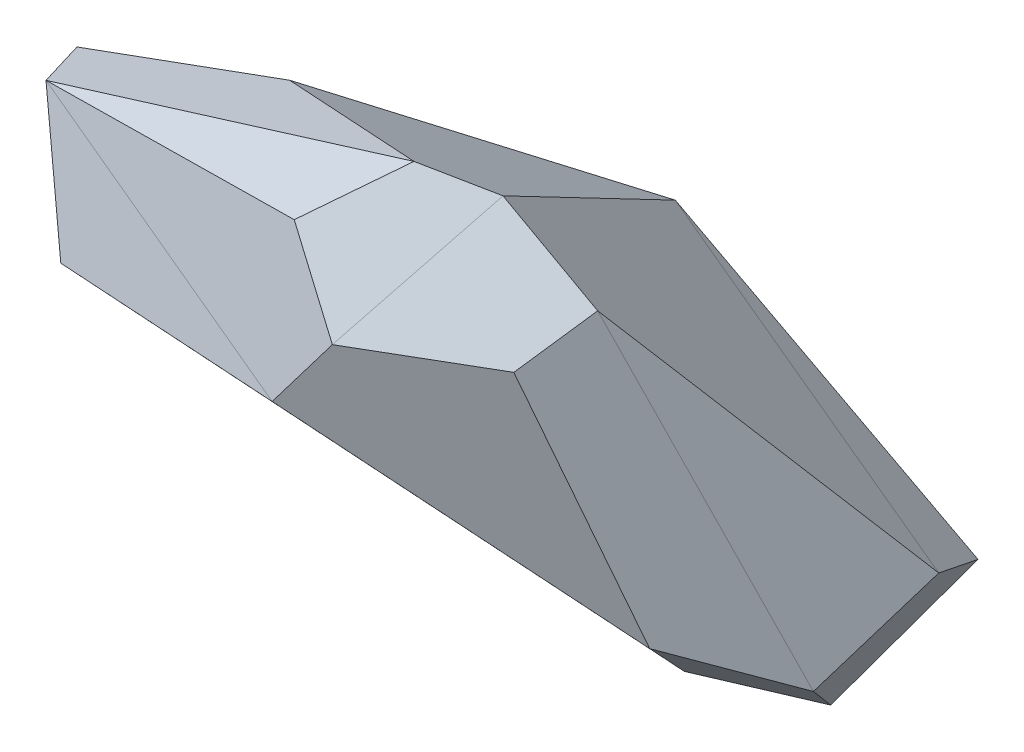
ISO-10303-21;
HEADER;
FILE_DESCRIPTION(('STEP AP214'),'2;1');
FILE_NAME('part.step','',(''),(''),'','','');
FILE_SCHEMA(('AUTOMOTIVE_DESIGN { 1 0 10303 214 1 1 1 1 }'));
ENDSEC;
DATA;
#1=APPLICATION_CONTEXT('core data for automotive mechanical design processes');
#2=APPLICATION_PROTOCOL_DEFINITION('international standard','automotive_design',2000,#1);
#3=PRODUCT_CONTEXT('',#1,'mechanical');
#4=PRODUCT('Part','Part','',(#3));
#5=PRODUCT_RELATED_PRODUCT_CATEGORY('part','',(#4));
#6=PRODUCT_DEFINITION_FORMATION('','',#4);
#7=PRODUCT_DEFINITION_CONTEXT('part definition',#1,'design');
#8=PRODUCT_DEFINITION('design','',#6,#7);
#9=PRODUCT_DEFINITION_SHAPE('','',#8);
#10=(LENGTH_UNIT() NAMED_UNIT(*) SI_UNIT(.MILLI.,.METRE.));
#11=(NAMED_UNIT(*) PLANE_ANGLE_UNIT() SI_UNIT($,.RADIAN.));
#12=(NAMED_UNIT(*) SI_UNIT($,.STERADIAN.) SOLID_ANGLE_UNIT());
#13=UNCERTAINTY_MEASURE_WITH_UNIT(LENGTH_MEASURE(1.E-05),#10,'distance_accuracy_value','');
#14=(GEOMETRIC_REPRESENTATION_CONTEXT(3) GLOBAL_UNCERTAINTY_ASSIGNED_CONTEXT((#13)) GLOBAL_UNIT_ASSIGNED_CONTEXT((#10,
#11,#12)) REPRESENTATION_CONTEXT('',''));
#15=CARTESIAN_POINT('',(0.,0.,0.));
#16=DIRECTION('',(0.,0.,1.));
#17=DIRECTION('',(1.,0.,0.));
#18=AXIS2_PLACEMENT_3D('',#15,#16,#17);
#19=CARTESIAN_POINT('',(-2.09892344621578,18.4063837587297,34.6763323115808));
#20=DIRECTION('',(-0.297455677009963,0.155004880453172,-0.942068791145446));
#21=DIRECTION('',(0.94644728230118,0.177610310381171,-0.269614761226114));
#22=AXIS2_PLACEMENT_3D('',#19,#20,#21);
#23=PLANE('',#22);
#24=DIRECTION('',(0.94644728230118,0.177610310381171,-0.269614761226113));
#25=VECTOR('',#24,1.);
#26=CARTESIAN_POINT('',(6.29828554401072,19.9822041165878,32.2842165126311));
#27=LINE('',#26,#25);
#28=CARTESIAN_POINT('',(-2.09892344621578,18.4063837587297,34.6763323115808));
#29=VERTEX_POINT('',#28);
#30=CARTESIAN_POINT('',(14.6954945342372,21.558024474446,29.8921007136813));
#31=VERTEX_POINT('',#30);
#32=EDGE_CURVE('E3185',#29,#31,#27,.T.);
#33=ORIENTED_EDGE('',*,*,#32,.F.);
#34=DIRECTION('',(-0.594855869065675,-0.801887428335408,0.0558842313693848));
#35=VECTOR('',#34,1.);
#36=CARTESIAN_POINT('',(-5.37063072607699,13.996002902885,34.9836955841124));
#37=LINE('',#36,#35);
#38=CARTESIAN_POINT('',(-8.6423380059382,9.58562204704023,35.291058856644));
#39=VERTEX_POINT('',#38);
#40=EDGE_CURVE('E3161',#29,#39,#37,.T.);
#41=ORIENTED_EDGE('',*,*,#40,.T.);
#42=DIRECTION('',(0.846057099966531,-0.414418816290542,-0.335327344993769));
#43=VECTOR('',#42,1.);
#44=CARTESIAN_POINT('',(7.43274689342594,1.71166453751991,28.9198393017624));
#45=LINE('',#44,#43);
#46=CARTESIAN_POINT('',(23.5078317927901,-6.16229297200041,22.5486197468808));
#47=VERTEX_POINT('',#46);
#48=EDGE_CURVE('E3177',#39,#47,#45,.T.);
#49=ORIENTED_EDGE('',*,*,#48,.T.);
#50=DIRECTION('',(0.293744575285096,-0.924010581548212,-0.244782698893352));
#51=VECTOR('',#50,1.);
#52=CARTESIAN_POINT('',(19.1016631635137,7.69786575122277,26.220360230281));
#53=LINE('',#52,#51);
#54=EDGE_CURVE('E3075',#31,#47,#53,.T.);
#55=ORIENTED_EDGE('',*,*,#54,.F.);
#56=EDGE_LOOP('',(#33,#41,#49,#55));
#57=FACE_BOUND('',#56,.T.);
#58=ADVANCED_FACE('F3072',(#57),#23,.F.);
#59=CARTESIAN_POINT('',(14.6954945342372,21.558024474446,29.8921007136813));
#60=DIRECTION('',(0.614697790089484,-0.0135095899664102,0.788647017263138));
#61=DIRECTION('',(0.293744575285096,-0.924010581548212,-0.244782698893352));
#62=AXIS2_PLACEMENT_3D('',#59,#60,#61);
#63=PLANE('',#62);
#64=ORIENTED_EDGE('',*,*,#54,.T.);
#65=DIRECTION('',(0.766230871240792,-0.227047819556639,-0.60111524651447));
#66=VECTOR('',#65,1.);
#67=CARTESIAN_POINT('',(28.9628924384361,-7.77872435271143,18.2690739235066));
#68=LINE('',#67,#66);
#69=CARTESIAN_POINT('',(34.4179530840821,-9.39515573342245,13.9895281001324));
#70=VERTEX_POINT('',#69);
#71=EDGE_CURVE('E3176',#47,#70,#68,.T.);
#72=ORIENTED_EDGE('',*,*,#71,.T.);
#73=DIRECTION('',(-0.333553617036009,0.901599573935553,0.275427291388173));
#74=VECTOR('',#73,1.);
#75=CARTESIAN_POINT('',(27.3933069480253,9.59255011008235,19.7900326049468));
#76=LINE('',#75,#74);
#77=CARTESIAN_POINT('',(20.3686608119686,28.5802559535871,25.5905371097612));
#78=VERTEX_POINT('',#77);
#79=EDGE_CURVE('E3201',#70,#78,#76,.T.);
#80=ORIENTED_EDGE('',*,*,#79,.T.);
#81=DIRECTION('',(0.567316627773139,0.702223147914119,-0.430156360392008));
#82=VECTOR('',#81,1.);
#83=CARTESIAN_POINT('',(17.5320776731029,25.0691402140165,27.7413189117213));
#84=LINE('',#83,#82);
#85=EDGE_CURVE('E3196',#31,#78,#84,.T.);
#86=ORIENTED_EDGE('',*,*,#85,.F.);
#87=EDGE_LOOP('',(#64,#72,#80,#86));
#88=FACE_BOUND('',#87,.T.);
#89=ADVANCED_FACE('F3390',(#88),#63,.T.);
#90=CARTESIAN_POINT('',(-42.3077182006926,22.4414726260732,28.5185493470746));
#91=DIRECTION('',(0.132898567566858,-0.166675754850237,-0.977014413140247));
#92=DIRECTION('',(0.918128581686899,-0.350607175389791,0.184701153366177));
#93=AXIS2_PLACEMENT_3D('',#90,#91,#92);
#94=PLANE('',#93);
#95=DIRECTION('',(-0.918128581686899,0.350607175389791,-0.184701153366177));
#96=VECTOR('',#95,1.);
#97=CARTESIAN_POINT('',(-25.4750281033154,16.0135473365567,31.9048041018593));
#98=LINE('',#97,#96);
#99=CARTESIAN_POINT('',(-42.3077182006926,22.4414726260732,28.5185493470746));
#100=VERTEX_POINT('',#99);
#101=EDGE_CURVE('E3156',#39,#100,#98,.T.);
#102=ORIENTED_EDGE('',*,*,#101,.T.);
#103=DIRECTION('',(0.311518313119949,-0.928777300135052,0.200820983327802));
#104=VECTOR('',#103,1.);
#105=CARTESIAN_POINT('',(-39.8325310795823,15.0618178357988,30.1141843086387));
#106=LINE('',#105,#104);
#107=CARTESIAN_POINT('',(-37.3573439584721,7.68216304552448,31.7098192702028));
#108=VERTEX_POINT('',#107);
#109=EDGE_CURVE('E3171',#100,#108,#106,.T.);
#110=ORIENTED_EDGE('',*,*,#109,.T.);
#111=DIRECTION('',(-0.990172619052892,-0.0656365172936465,-0.123491020222109));
#112=VECTOR('',#111,1.);
#113=CARTESIAN_POINT('',(-22.9998409822051,8.63389254628235,33.5004390634234));
#114=LINE('',#113,#112);
#115=EDGE_CURVE('E3168',#39,#108,#114,.T.);
#116=ORIENTED_EDGE('',*,*,#115,.F.);
#117=EDGE_LOOP('',(#102,#110,#116));
#118=FACE_BOUND('',#117,.T.);
#119=ADVANCED_FACE('F3170',(#118),#94,.F.);
#120=CARTESIAN_POINT('',(-2.09892344621578,18.4063837587297,34.6763323115808));
#121=DIRECTION('',(-0.132898567566857,0.166675754850237,0.977014413140247));
#122=DIRECTION('',(-0.625353966159292,0.750672727387448,-0.213126425779474));
#123=AXIS2_PLACEMENT_3D('',#120,#121,#122);
#124=PLANE('',#123);
#125=DIRECTION('',(0.625353966159292,-0.750672727387448,0.213126425779473));
#126=VECTOR('',#125,1.);
#127=CARTESIAN_POINT('',(-5.53837026009189,22.5350837593607,33.5041369697937));
#128=LINE('',#127,#126);
#129=CARTESIAN_POINT('',(-8.97781707396799,26.6637837599916,32.3319416280066));
#130=VERTEX_POINT('',#129);
#131=EDGE_CURVE('E3219',#130,#29,#128,.T.);
#132=ORIENTED_EDGE('',*,*,#131,.F.);
#133=DIRECTION('',(-0.985741420922727,-0.124876067315704,-0.112782174517991));
#134=VECTOR('',#133,1.);
#135=CARTESIAN_POINT('',(-25.6427676373303,24.5526281930324,30.4252454875406));
#136=LINE('',#135,#134);
#137=EDGE_CURVE('E3162',#130,#100,#136,.T.);
#138=ORIENTED_EDGE('',*,*,#137,.T.);
#139=ORIENTED_EDGE('',*,*,#101,.F.);
#140=ORIENTED_EDGE('',*,*,#40,.F.);
#141=EDGE_LOOP('',(#132,#138,#139,#140));
#142=FACE_BOUND('',#141,.T.);
#143=ADVANCED_FACE('F3159',(#142),#124,.T.);
#144=CARTESIAN_POINT('',(-8.6423380059382,9.58562204704023,35.291058856644));
#145=DIRECTION('',(-0.0456387462814506,-0.683021414363463,0.728971091579626));
#146=DIRECTION('',(-0.990172619052892,-0.0656365172936463,-0.123491020222109));
#147=AXIS2_PLACEMENT_3D('',#144,#145,#146);
#148=PLANE('',#147);
#149=ORIENTED_EDGE('',*,*,#115,.T.);
#150=DIRECTION('',(-0.22446108834939,-0.704060010426134,-0.673733420230702));
#151=VECTOR('',#150,1.);
#152=CARTESIAN_POINT('',(-38.8163410327431,3.10577297775462,27.3305520387033));
#153=LINE('',#152,#151);
#154=CARTESIAN_POINT('',(-40.2753381070141,-1.47061709001525,22.9512848072037));
#155=VERTEX_POINT('',#154);
#156=EDGE_CURVE('E3205',#108,#155,#153,.T.);
#157=ORIENTED_EDGE('',*,*,#156,.T.);
#158=DIRECTION('',(0.997285872786953,-0.073357001292804,-0.0062958955592176));
#159=VECTOR('',#158,1.);
#160=CARTESIAN_POINT('',(-8.38375315711202,-3.81645503100783,22.7499522770422));
#161=LINE('',#160,#159);
#162=EDGE_CURVE('E3181',#155,#47,#161,.T.);
#163=ORIENTED_EDGE('',*,*,#162,.T.);
#164=ORIENTED_EDGE('',*,*,#48,.F.);
#165=EDGE_LOOP('',(#149,#157,#163,#164));
#166=FACE_BOUND('',#165,.T.);
#167=ADVANCED_FACE('F3180',(#166),#148,.T.);
#168=CARTESIAN_POINT('',(15.1328414363407,-18.9438187059818,10.0484260495026));
#169=DIRECTION('',(-0.250607009139643,0.755818503580984,-0.604925215720658));
#170=DIRECTION('',(0.424213196710011,0.64741470254567,0.633164565231485));
#171=AXIS2_PLACEMENT_3D('',#168,#169,#170);
#172=PLANE('',#171);
#173=DIRECTION('',(0.424213196710011,0.647414702545669,0.633164565231485));
#174=VECTOR('',#173,1.);
#175=CARTESIAN_POINT('',(19.3203366145654,-12.5530558389911,16.2985228981917));
#176=LINE('',#175,#174);
#177=CARTESIAN_POINT('',(15.1328414363407,-18.9438187059818,10.0484260495026));
#178=VERTEX_POINT('',#177);
#179=EDGE_CURVE('E3224',#178,#47,#176,.T.);
#180=ORIENTED_EDGE('',*,*,#179,.F.);
#181=DIRECTION('',(0.953520748583935,0.0847171222608654,-0.289173289250183));
#182=VECTOR('',#181,1.);
#183=CARTESIAN_POINT('',(21.8074866764283,-18.3507988501557,8.02421302475128));
#184=LINE('',#183,#182);
#185=CARTESIAN_POINT('',(28.4821319165158,-17.7577789943297,6.));
#186=VERTEX_POINT('',#185);
#187=EDGE_CURVE('E3227',#178,#186,#184,.T.);
#188=ORIENTED_EDGE('',*,*,#187,.T.);
#189=DIRECTION('',(0.456601628274327,0.64327871237748,0.614579084625571));
#190=VECTOR('',#189,1.);
#191=CARTESIAN_POINT('',(31.450042500299,-13.5764673638761,9.99476405006621));
#192=LINE('',#191,#190);
#193=EDGE_CURVE('E3239',#186,#70,#192,.T.);
#194=ORIENTED_EDGE('',*,*,#193,.T.);
#195=ORIENTED_EDGE('',*,*,#71,.F.);
#196=EDGE_LOOP('',(#180,#188,#194,#195));
#197=FACE_BOUND('',#196,.T.);
#198=ADVANCED_FACE('F3401',(#197),#172,.F.);
#199=CARTESIAN_POINT('',(-2.09892344621578,18.4063837587297,34.6763323115808));
#200=DIRECTION('',(0.179618886480074,0.404256945620397,0.89683520087992));
#201=DIRECTION('',(0.94644728230118,0.177610310381171,-0.269614761226114));
#202=AXIS2_PLACEMENT_3D('',#199,#200,#201);
#203=PLANE('',#202);
#204=ORIENTED_EDGE('',*,*,#32,.T.);
#205=ORIENTED_EDGE('',*,*,#85,.T.);
#206=DIRECTION('',(-0.891448093755237,0.452411003303571,-0.0253885846397657));
#207=VECTOR('',#206,1.);
#208=CARTESIAN_POINT('',(14.5742482025596,31.5209274750604,25.4255113096028));
#209=LINE('',#208,#207);
#210=CARTESIAN_POINT('',(8.77983559315053,34.4615989965336,25.2604855094443));
#211=VERTEX_POINT('',#210);
#212=EDGE_CURVE('E3243',#78,#211,#209,.T.);
#213=ORIENTED_EDGE('',*,*,#212,.T.);
#214=DIRECTION('',(0.504612194397336,0.744722570226326,-0.436754881668197));
#215=VECTOR('',#214,1.);
#216=CARTESIAN_POINT('',(3.34045607346737,26.4339913776316,29.9684089105125));
#217=LINE('',#216,#215);
#218=EDGE_CURVE('E3216',#29,#211,#217,.T.);
#219=ORIENTED_EDGE('',*,*,#218,.F.);
#220=EDGE_LOOP('',(#204,#205,#213,#219));
#221=FACE_BOUND('',#220,.T.);
#222=ADVANCED_FACE('F3387',(#221),#203,.T.);
#223=CARTESIAN_POINT('',(34.4179530840821,-9.39515573342245,13.9895281001324));
#224=DIRECTION('',(-0.614697790089484,0.0135095899664101,-0.788647017263138));
#225=DIRECTION('',(-0.333553617036009,0.901599573935553,0.275427291388173));
#226=AXIS2_PLACEMENT_3D('',#223,#224,#225);
#227=PLANE('',#226);
#228=ORIENTED_EDGE('',*,*,#79,.F.);
#229=DIRECTION('',(0.500325148469735,0.779638384146126,-0.376614837433094));
#230=VECTOR('',#229,1.);
#231=CARTESIAN_POINT('',(38.6707168460748,-2.76822946818038,10.7883019819511));
#232=LINE('',#231,#230);
#233=CARTESIAN_POINT('',(42.9234806080676,3.85869679706168,7.58707586376983));
#234=VERTEX_POINT('',#233);
#235=EDGE_CURVE('E3235',#70,#234,#232,.T.);
#236=ORIENTED_EDGE('',*,*,#235,.T.);
#237=DIRECTION('',(0.593547889371026,-0.650567346224354,-0.473775295947142));
#238=VECTOR('',#237,1.);
#239=CARTESIAN_POINT('',(31.6460707100181,16.2194763753244,16.5888064867655));
#240=LINE('',#239,#238);
#241=EDGE_CURVE('E3247',#78,#234,#240,.T.);
#242=ORIENTED_EDGE('',*,*,#241,.F.);
#243=EDGE_LOOP('',(#228,#236,#242));
#244=FACE_BOUND('',#243,.T.);
#245=ADVANCED_FACE('F3393',(#244),#227,.F.);
#246=CARTESIAN_POINT('',(-42.3077182006926,22.4414726260732,28.5185493470746));
#247=DIRECTION('',(-0.858397334777297,-0.184408911421273,0.4786933977356));
#248=DIRECTION('',(-0.432085413612605,-0.243069479192463,-0.868458072464255));
#249=AXIS2_PLACEMENT_3D('',#246,#247,#248);
#250=PLANE('',#249);
#251=DIRECTION('',(-0.432085413612602,-0.243069479192461,-0.868458072464257));
#252=VECTOR('',#251,1.);
#253=CARTESIAN_POINT('',(-44.1320059162753,21.4152202904147,24.8518729373134));
#254=LINE('',#253,#252);
#255=CARTESIAN_POINT('',(-45.9562936318581,20.3889679547562,21.1851965275523));
#256=VERTEX_POINT('',#255);
#257=EDGE_CURVE('E3253',#100,#256,#254,.T.);
#258=ORIENTED_EDGE('',*,*,#257,.T.);
#259=DIRECTION('',(-0.250763181954698,0.964904421107351,-0.0779569413422691));
#260=VECTOR('',#259,1.);
#261=CARTESIAN_POINT('',(-43.1158158694361,9.45917543237046,22.068240667378));
#262=LINE('',#261,#260);
#263=EDGE_CURVE('E3250',#155,#256,#262,.T.);
#264=ORIENTED_EDGE('',*,*,#263,.F.);
#265=ORIENTED_EDGE('',*,*,#156,.F.);
#266=ORIENTED_EDGE('',*,*,#109,.F.);
#267=EDGE_LOOP('',(#258,#264,#265,#266));
#268=FACE_BOUND('',#267,.T.);
#269=ADVANCED_FACE('F3375',(#268),#250,.T.);
#270=CARTESIAN_POINT('',(-8.97781707396799,26.6637837599916,32.3319416280066));
#271=DIRECTION('',(0.167774932974968,-0.678175936582941,-0.715492117989497));
#272=DIRECTION('',(-0.985741420922727,-0.124876067315704,-0.112782174517991));
#273=AXIS2_PLACEMENT_3D('',#270,#271,#272);
#274=PLANE('',#273);
#275=ORIENTED_EDGE('',*,*,#137,.F.);
#276=DIRECTION('',(0.6870528400917,0.600921682619212,-0.408474633582093));
#277=VECTOR('',#276,1.);
#278=CARTESIAN_POINT('',(-4.51197361337194,30.5697746970165,29.676856509723));
#279=LINE('',#278,#277);
#280=CARTESIAN_POINT('',(-0.0461301527758844,34.4757656340414,27.0217713914394));
#281=VERTEX_POINT('',#280);
#282=EDGE_CURVE('E3212',#130,#281,#279,.T.);
#283=ORIENTED_EDGE('',*,*,#282,.T.);
#284=DIRECTION('',(-0.96120923699618,-0.27371128569192,0.034043131437882));
#285=VECTOR('',#284,1.);
#286=CARTESIAN_POINT('',(-21.1769241767342,28.4586191300573,27.770160369257));
#287=LINE('',#286,#285);
#288=EDGE_CURVE('E3257',#281,#100,#287,.T.);
#289=ORIENTED_EDGE('',*,*,#288,.T.);
#290=EDGE_LOOP('',(#275,#283,#289));
#291=FACE_BOUND('',#290,.T.);
#292=ADVANCED_FACE('F3382',(#291),#274,.F.);
#293=CARTESIAN_POINT('',(-8.97781707396799,26.6637837599916,32.3319416280066));
#294=DIRECTION('',(0.179618886480067,0.404256945620393,0.896835200879923));
#295=DIRECTION('',(0.625353966159292,-0.750672727387448,0.213126425779474));
#296=AXIS2_PLACEMENT_3D('',#293,#294,#295);
#297=PLANE('',#296);
#298=ORIENTED_EDGE('',*,*,#131,.T.);
#299=ORIENTED_EDGE('',*,*,#218,.T.);
#300=DIRECTION('',(0.98066286065849,-0.00157407083420612,-0.195698431332791));
#301=VECTOR('',#300,1.);
#302=CARTESIAN_POINT('',(4.36685272018732,34.4686823152875,26.1411284504418));
#303=LINE('',#302,#301);
#304=EDGE_CURVE('E3267',#281,#211,#303,.T.);
#305=ORIENTED_EDGE('',*,*,#304,.F.);
#306=ORIENTED_EDGE('',*,*,#282,.F.);
#307=EDGE_LOOP('',(#298,#299,#305,#306));
#308=FACE_BOUND('',#307,.T.);
#309=ADVANCED_FACE('F3384',(#308),#297,.T.);
#310=CARTESIAN_POINT('',(-18.822702939603,-18.4551568705942,8.38042852433937));
#311=DIRECTION('',(-0.0456387462814504,-0.683021414363462,0.728971091579627));
#312=DIRECTION('',(0.998692481645404,-0.0143724069231654,0.0490587507400938));
#313=AXIS2_PLACEMENT_3D('',#310,#311,#312);
#314=PLANE('',#313);
#315=DIRECTION('',(0.998692481645404,-0.0143724069231654,0.0490587507400936));
#316=VECTOR('',#315,1.);
#317=CARTESIAN_POINT('',(-1.84493075163114,-18.699487788288,9.21442728692097));
#318=LINE('',#317,#316);
#319=CARTESIAN_POINT('',(-18.822702939603,-18.4551568705942,8.38042852433937));
#320=VERTEX_POINT('',#319);
#321=EDGE_CURVE('E3231',#320,#178,#318,.T.);
#322=ORIENTED_EDGE('',*,*,#321,.T.);
#323=ORIENTED_EDGE('',*,*,#179,.T.);
#324=ORIENTED_EDGE('',*,*,#162,.F.);
#325=DIRECTION('',(0.692020489271326,-0.547888380018675,-0.470027622027883));
#326=VECTOR('',#325,1.);
#327=CARTESIAN_POINT('',(-29.5490205233086,-9.96288698030471,15.6658566657715));
#328=LINE('',#327,#326);
#329=EDGE_CURVE('E3271',#155,#320,#328,.T.);
#330=ORIENTED_EDGE('',*,*,#329,.T.);
#331=EDGE_LOOP('',(#322,#323,#324,#330));
#332=FACE_BOUND('',#331,.T.);
#333=ADVANCED_FACE('F3373',(#332),#314,.T.);
#334=CARTESIAN_POINT('',(-18.822702939603,-18.4551568705942,8.38042852433937));
#335=DIRECTION('',(0.,-0.959664872997422,-0.281146459225155));
#336=DIRECTION('',(0.747357556512321,0.186799911485041,-0.637622518260697));
#337=AXIS2_PLACEMENT_3D('',#334,#335,#336);
#338=PLANE('',#337);
#339=DIRECTION('',(-0.747357556512321,-0.186799911485041,0.637622518260697));
#340=VECTOR('',#339,1.);
#341=CARTESIAN_POINT('',(-13.9113514698015,-17.2275784352971,4.19021426216968));
#342=LINE('',#341,#340);
#343=CARTESIAN_POINT('',(-8.99999999999999,-16.,0.));
#344=VERTEX_POINT('',#343);
#345=EDGE_CURVE('E3277',#344,#320,#342,.T.);
#346=ORIENTED_EDGE('',*,*,#345,.F.);
#347=DIRECTION('',(0.98637189253989,-0.0462573419560442,0.157894736842105));
#348=VECTOR('',#347,1.);
#349=CARTESIAN_POINT('',(9.74106595825792,-16.8788894971648,3.));
#350=LINE('',#349,#348);
#351=EDGE_CURVE('E3289',#344,#186,#350,.T.);
#352=ORIENTED_EDGE('',*,*,#351,.T.);
#353=ORIENTED_EDGE('',*,*,#187,.F.);
#354=ORIENTED_EDGE('',*,*,#321,.F.);
#355=EDGE_LOOP('',(#346,#352,#353,#354));
#356=FACE_BOUND('',#355,.T.);
#357=ADVANCED_FACE('F3369',(#356),#338,.T.);
#358=CARTESIAN_POINT('',(28.4821319165158,-17.7577789943297,6.));
#359=DIRECTION('',(0.83219891632312,-0.553077186895706,-0.0393775190452227));
#360=DIRECTION('',(0.52353945834019,0.807171772469531,-0.272727272727273));
#361=AXIS2_PLACEMENT_3D('',#358,#359,#360);
#362=PLANE('',#361);
#363=DIRECTION('',(-0.52353945834019,-0.807171772469531,0.272727272727273));
#364=VECTOR('',#363,1.);
#365=CARTESIAN_POINT('',(34.2410659582579,-8.87888949716484,3.));
#366=LINE('',#365,#364);
#367=CARTESIAN_POINT('',(40.,0.,0.));
#368=VERTEX_POINT('',#367);
#369=EDGE_CURVE('E3285',#368,#186,#366,.T.);
#370=ORIENTED_EDGE('',*,*,#369,.F.);
#371=DIRECTION('',(-0.324831178674177,-0.428744088562408,-0.843008429307759));
#372=VECTOR('',#371,1.);
#373=CARTESIAN_POINT('',(41.4617403040338,1.92934839853084,3.79353793188492));
#374=LINE('',#373,#372);
#375=EDGE_CURVE('E3293',#234,#368,#374,.T.);
#376=ORIENTED_EDGE('',*,*,#375,.F.);
#377=ORIENTED_EDGE('',*,*,#235,.F.);
#378=ORIENTED_EDGE('',*,*,#193,.F.);
#379=EDGE_LOOP('',(#370,#376,#377,#378));
#380=FACE_BOUND('',#379,.T.);
#381=ADVANCED_FACE('F3362',(#380),#362,.T.);
#382=CARTESIAN_POINT('',(20.3686608119686,28.5802559535871,25.5905371097612));
#383=DIRECTION('',(0.394984485957697,0.748391657604056,-0.53282002841615));
#384=DIRECTION('',(0.593547889371026,-0.650567346224354,-0.473775295947142));
#385=AXIS2_PLACEMENT_3D('',#382,#383,#384);
#386=PLANE('',#385);
#387=ORIENTED_EDGE('',*,*,#241,.T.);
#388=DIRECTION('',(-0.916961563081809,0.356699679349442,-0.178736763377237));
#389=VECTOR('',#388,1.);
#390=CARTESIAN_POINT('',(23.4617403040338,11.4293483985308,3.79353793188491));
#391=LINE('',#390,#389);
#392=CARTESIAN_POINT('',(4.,19.,0.));
#393=VERTEX_POINT('',#392);
#394=EDGE_CURVE('E3297',#234,#393,#391,.T.);
#395=ORIENTED_EDGE('',*,*,#394,.T.);
#396=DIRECTION('',(-0.159327853105019,-0.515386633217786,-0.842016183648142));
#397=VECTOR('',#396,1.);
#398=CARTESIAN_POINT('',(6.38991779657526,26.7307994982668,12.6302427547221));
#399=LINE('',#398,#397);
#400=EDGE_CURVE('E3264',#211,#393,#399,.T.);
#401=ORIENTED_EDGE('',*,*,#400,.F.);
#402=ORIENTED_EDGE('',*,*,#212,.F.);
#403=EDGE_LOOP('',(#387,#395,#401,#402));
#404=FACE_BOUND('',#403,.T.);
#405=ADVANCED_FACE('F3353',(#404),#386,.T.);
#406=CARTESIAN_POINT('',(-40.2753381070141,-1.47061709001525,22.9512848072037));
#407=DIRECTION('',(0.966924593671489,0.253537891262969,0.0278454277602829));
#408=DIRECTION('',(0.0119712220440928,0.0639398734789239,-0.997881948139293));
#409=AXIS2_PLACEMENT_3D('',#406,#407,#408);
#410=PLANE('',#409);
#411=DIRECTION('',(-0.0119712220440925,-0.0639398734789238,0.997881948139293));
#412=VECTOR('',#411,1.);
#413=CARTESIAN_POINT('',(-40.1376690535071,-0.735308545007626,11.4756424036019));
#414=LINE('',#413,#412);
#415=CARTESIAN_POINT('',(-40.,0.,0.));
#416=VERTEX_POINT('',#415);
#417=EDGE_CURVE('E3091',#416,#155,#414,.T.);
#418=ORIENTED_EDGE('',*,*,#417,.T.);
#419=ORIENTED_EDGE('',*,*,#263,.T.);
#420=DIRECTION('',(0.198543121061937,-0.679632265158539,-0.706173217585075));
#421=VECTOR('',#420,1.);
#422=CARTESIAN_POINT('',(-42.9781468159291,10.1944839773781,10.5925982637761));
#423=LINE('',#422,#421);
#424=EDGE_CURVE('E3301',#256,#416,#423,.T.);
#425=ORIENTED_EDGE('',*,*,#424,.T.);
#426=EDGE_LOOP('',(#418,#419,#425));
#427=FACE_BOUND('',#426,.T.);
#428=ADVANCED_FACE('F3343',(#427),#410,.F.);
#429=CARTESIAN_POINT('',(-0.0461301527758841,34.4757656340414,27.0217713914394));
#430=DIRECTION('',(0.275804107982191,-0.952469227025457,0.129361762471279));
#431=DIRECTION('',(-0.96120923699618,-0.273711285691921,0.0340431314378821));
#432=AXIS2_PLACEMENT_3D('',#429,#430,#431);
#433=PLANE('',#432);
#434=ORIENTED_EDGE('',*,*,#288,.F.);
#435=DIRECTION('',(-0.890068154382528,-0.303879833957021,-0.339758336274966));
#436=VECTOR('',#435,1.);
#437=CARTESIAN_POINT('',(-12.0112754740534,30.3907229824213,22.4544156809481));
#438=LINE('',#437,#436);
#439=CARTESIAN_POINT('',(-23.9764207953309,26.3056803308012,17.8870599704569));
#440=VERTEX_POINT('',#439);
#441=EDGE_CURVE('E3260',#281,#440,#438,.T.);
#442=ORIENTED_EDGE('',*,*,#441,.T.);
#443=DIRECTION('',(-0.955646645066401,-0.25724836417587,0.143397241612841));
#444=VECTOR('',#443,1.);
#445=CARTESIAN_POINT('',(-34.9663572135945,23.3473241427787,19.5361282490046));
#446=LINE('',#445,#444);
#447=EDGE_CURVE('E3305',#440,#256,#446,.T.);
#448=ORIENTED_EDGE('',*,*,#447,.T.);
#449=ORIENTED_EDGE('',*,*,#257,.F.);
#450=EDGE_LOOP('',(#434,#442,#448,#449));
#451=FACE_BOUND('',#450,.T.);
#452=ADVANCED_FACE('F3377',(#451),#433,.F.);
#453=CARTESIAN_POINT('',(-0.0461301527758858,34.4757656340414,27.0217713914394));
#454=DIRECTION('',(-0.0995393095161111,0.85695163424019,-0.505693407544654));
#455=DIRECTION('',(0.980662860658491,-0.00157407083420457,-0.19569843133279));
#456=AXIS2_PLACEMENT_3D('',#453,#454,#455);
#457=PLANE('',#456);
#458=ORIENTED_EDGE('',*,*,#304,.T.);
#459=ORIENTED_EDGE('',*,*,#400,.T.);
#460=DIRECTION('',(0.822835905745027,-0.214872950905917,-0.526089999131085));
#461=VECTOR('',#460,1.);
#462=CARTESIAN_POINT('',(-9.98821039766546,22.6528401654006,8.94352998522845));
#463=LINE('',#462,#461);
#464=EDGE_CURVE('E3309',#440,#393,#463,.T.);
#465=ORIENTED_EDGE('',*,*,#464,.F.);
#466=ORIENTED_EDGE('',*,*,#441,.F.);
#467=EDGE_LOOP('',(#458,#459,#465,#466));
#468=FACE_BOUND('',#467,.T.);
#469=ADVANCED_FACE('F3378',(#468),#457,.T.);
#470=CARTESIAN_POINT('',(-40.,0.,0.));
#471=DIRECTION('',(-0.643101383234503,-0.763682892590973,-0.0566484814072997));
#472=DIRECTION('',(0.764911198117051,-0.64413574578278,0.));
#473=AXIS2_PLACEMENT_3D('',#470,#471,#472);
#474=PLANE('',#473);
#475=DIRECTION('',(0.764911198117051,-0.64413574578278,0.));
#476=VECTOR('',#475,1.);
#477=CARTESIAN_POINT('',(-40.,0.,0.));
#478=LINE('',#477,#476);
#479=CARTESIAN_POINT('',(-21.,-16.,0.));
#480=VERTEX_POINT('',#479);
#481=EDGE_CURVE('E3312',#416,#480,#478,.T.);
#482=ORIENTED_EDGE('',*,*,#481,.T.);
#483=DIRECTION('',(0.241921895599664,-0.272795207843797,0.931158724926596));
#484=VECTOR('',#483,1.);
#485=CARTESIAN_POINT('',(-19.9113514698015,-17.2275784352971,4.19021426216968));
#486=LINE('',#485,#484);
#487=EDGE_CURVE('E3281',#480,#320,#486,.T.);
#488=ORIENTED_EDGE('',*,*,#487,.T.);
#489=ORIENTED_EDGE('',*,*,#329,.F.);
#490=ORIENTED_EDGE('',*,*,#417,.F.);
#491=EDGE_LOOP('',(#482,#488,#489,#490));
#492=FACE_BOUND('',#491,.T.);
#493=ADVANCED_FACE('F3331',(#492),#474,.T.);
#494=CARTESIAN_POINT('',(-21.,-16.,0.));
#495=DIRECTION('',(0.,0.959664872997422,0.281146459225155));
#496=DIRECTION('',(0.241921895599664,-0.272795207843797,0.931158724926596));
#497=AXIS2_PLACEMENT_3D('',#494,#495,#496);
#498=PLANE('',#497);
#499=ORIENTED_EDGE('',*,*,#487,.F.);
#500=DIRECTION('',(1.,0.,0.));
#501=VECTOR('',#500,1.);
#502=CARTESIAN_POINT('',(-21.,-16.,0.));
#503=LINE('',#502,#501);
#504=EDGE_CURVE('E3321',#480,#344,#503,.T.);
#505=ORIENTED_EDGE('',*,*,#504,.T.);
#506=ORIENTED_EDGE('',*,*,#345,.T.);
#507=EDGE_LOOP('',(#499,#505,#506));
#508=FACE_BOUND('',#507,.T.);
#509=ADVANCED_FACE('F3371',(#508),#498,.F.);
#510=CARTESIAN_POINT('',(-8.99999999999999,-16.,0.));
#511=DIRECTION('',(-0.127599596870368,0.390773765415502,0.911599806461975));
#512=DIRECTION('',(0.98637189253989,-0.0462573419560442,0.157894736842105));
#513=AXIS2_PLACEMENT_3D('',#510,#511,#512);
#514=PLANE('',#513);
#515=ORIENTED_EDGE('',*,*,#351,.F.);
#516=DIRECTION('',(0.95060545649098,0.310401781711341,0.));
#517=VECTOR('',#516,1.);
#518=CARTESIAN_POINT('',(-8.99999999999999,-16.,0.));
#519=LINE('',#518,#517);
#520=EDGE_CURVE('E3317',#344,#368,#519,.T.);
#521=ORIENTED_EDGE('',*,*,#520,.T.);
#522=ORIENTED_EDGE('',*,*,#369,.T.);
#523=EDGE_LOOP('',(#515,#521,#522));
#524=FACE_BOUND('',#523,.T.);
#525=ADVANCED_FACE('F3365',(#524),#514,.F.);
#526=CARTESIAN_POINT('',(42.9234806080676,3.85869679706168,7.58707586376983));
#527=DIRECTION('',(-0.394984485957697,-0.748391657604057,0.532820028416149));
#528=DIRECTION('',(-0.916961563081809,0.356699679349442,-0.178736763377237));
#529=AXIS2_PLACEMENT_3D('',#526,#527,#528);
#530=PLANE('',#529);
#531=ORIENTED_EDGE('',*,*,#394,.F.);
#532=ORIENTED_EDGE('',*,*,#375,.T.);
#533=DIRECTION('',(-0.88438475284697,0.466758619558123,0.));
#534=VECTOR('',#533,1.);
#535=CARTESIAN_POINT('',(40.,0.,0.));
#536=LINE('',#535,#534);
#537=EDGE_CURVE('E3082',#368,#393,#536,.T.);
#538=ORIENTED_EDGE('',*,*,#537,.T.);
#539=EDGE_LOOP('',(#531,#532,#538));
#540=FACE_BOUND('',#539,.T.);
#541=ADVANCED_FACE('F3358',(#540),#530,.F.);
#542=CARTESIAN_POINT('',(-23.9764207953309,26.3056803308012,17.8870599704569));
#543=DIRECTION('',(-0.281021870256129,0.650787489014192,-0.705338466681316));
#544=DIRECTION('',(0.822835905745027,-0.214872950905917,-0.526089999131085));
#545=AXIS2_PLACEMENT_3D('',#542,#543,#544);
#546=PLANE('',#545);
#547=ORIENTED_EDGE('',*,*,#464,.T.);
#548=DIRECTION('',(-0.91806235353619,-0.396436016299719,0.));
#549=VECTOR('',#548,1.);
#550=CARTESIAN_POINT('',(4.,19.,0.));
#551=LINE('',#550,#549);
#552=EDGE_CURVE('E12',#393,#416,#551,.T.);
#553=ORIENTED_EDGE('',*,*,#552,.T.);
#554=ORIENTED_EDGE('',*,*,#424,.F.);
#555=ORIENTED_EDGE('',*,*,#447,.F.);
#556=EDGE_LOOP('',(#547,#553,#554,#555));
#557=FACE_BOUND('',#556,.T.);
#558=ADVANCED_FACE('F3346',(#557),#546,.T.);
#559=CARTESIAN_POINT('',(0.,0.,0.));
#560=DIRECTION('',(0.,0.,-1.));
#561=DIRECTION('',(-1.,0.,0.));
#562=AXIS2_PLACEMENT_3D('',#559,#560,#561);
#563=PLANE('',#562);
#564=ORIENTED_EDGE('',*,*,#481,.F.);
#565=ORIENTED_EDGE('',*,*,#552,.F.);
#566=ORIENTED_EDGE('',*,*,#537,.F.);
#567=ORIENTED_EDGE('',*,*,#520,.F.);
#568=ORIENTED_EDGE('',*,*,#504,.F.);
#569=EDGE_LOOP('',(#564,#565,#566,#567,#568));
#570=FACE_BOUND('',#569,.T.);
#571=ADVANCED_FACE('F3338',(#570),#563,.T.);
#572=CLOSED_SHELL('',(#58,#89,#119,#143,#167,#198,#222,#245,#269,#292,#309,#333,#357,#381,#405,
#428,#452,#469,#493,#509,#525,#541,#558,#571));
#573=MANIFOLD_SOLID_BREP('B2',#572);
#574=ADVANCED_BREP_SHAPE_REPRESENTATION('',(#18,#573),#14);
#575=SHAPE_DEFINITION_REPRESENTATION(#9,#574);
ENDSEC;
END-ISO-10303-21;
